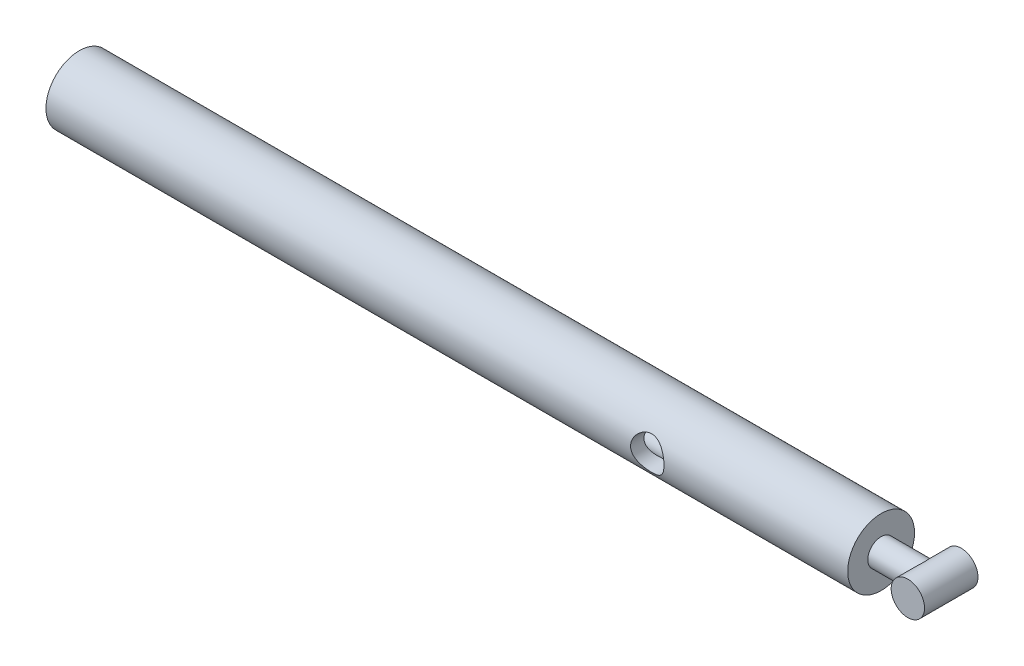
ISO-10303-21;
HEADER;
FILE_DESCRIPTION(('STEP AP214'),'2;1');
FILE_NAME('part.step','',(''),(''),'','','');
FILE_SCHEMA(('AUTOMOTIVE_DESIGN { 1 0 10303 214 1 1 1 1 }'));
ENDSEC;
DATA;
#1=APPLICATION_CONTEXT('core data for automotive mechanical design processes');
#2=APPLICATION_PROTOCOL_DEFINITION('international standard','automotive_design',2000,#1);
#3=PRODUCT_CONTEXT('',#1,'mechanical');
#4=PRODUCT('Part','Part','',(#3));
#5=PRODUCT_RELATED_PRODUCT_CATEGORY('part','',(#4));
#6=PRODUCT_DEFINITION_FORMATION('','',#4);
#7=PRODUCT_DEFINITION_CONTEXT('part definition',#1,'design');
#8=PRODUCT_DEFINITION('design','',#6,#7);
#9=PRODUCT_DEFINITION_SHAPE('','',#8);
#10=(LENGTH_UNIT() NAMED_UNIT(*) SI_UNIT(.MILLI.,.METRE.));
#11=(NAMED_UNIT(*) PLANE_ANGLE_UNIT() SI_UNIT($,.RADIAN.));
#12=(NAMED_UNIT(*) SI_UNIT($,.STERADIAN.) SOLID_ANGLE_UNIT());
#13=UNCERTAINTY_MEASURE_WITH_UNIT(LENGTH_MEASURE(1.E-05),#10,'distance_accuracy_value','');
#14=(GEOMETRIC_REPRESENTATION_CONTEXT(3) GLOBAL_UNCERTAINTY_ASSIGNED_CONTEXT((#13)) GLOBAL_UNIT_ASSIGNED_CONTEXT((#10,
#11,#12)) REPRESENTATION_CONTEXT('',''));
#15=CARTESIAN_POINT('',(0.,0.,0.));
#16=DIRECTION('',(0.,0.,1.));
#17=DIRECTION('',(1.,0.,0.));
#18=AXIS2_PLACEMENT_3D('',#15,#16,#17);
#19=CARTESIAN_POINT('',(0.,0.,0.));
#20=DIRECTION('',(1.,0.,0.));
#21=DIRECTION('',(0.,0.,-1.));
#22=AXIS2_PLACEMENT_3D('',#19,#20,#21);
#23=PLANE('',#22);
#24=CARTESIAN_POINT('',(0.,0.,0.));
#25=DIRECTION('',(1.,0.,0.));
#26=DIRECTION('',(0.,0.,-1.));
#27=AXIS2_PLACEMENT_3D('',#24,#25,#26);
#28=CIRCLE('',#27,5.);
#29=CARTESIAN_POINT('',(0.,0.,-5.));
#30=VERTEX_POINT('',#29);
#31=EDGE_CURVE('E45',#30,#30,#28,.T.);
#32=ORIENTED_EDGE('',*,*,#31,.T.);
#33=EDGE_LOOP('',(#32));
#34=FACE_BOUND('',#33,.T.);
#35=CARTESIAN_POINT('',(0.,0.,0.));
#36=DIRECTION('',(1.,0.,0.));
#37=DIRECTION('',(0.,0.,-1.));
#38=AXIS2_PLACEMENT_3D('',#35,#36,#37);
#39=CIRCLE('',#38,2.);
#40=CARTESIAN_POINT('',(0.,0.,-2.));
#41=VERTEX_POINT('',#40);
#42=EDGE_CURVE('E61',#41,#41,#39,.T.);
#43=ORIENTED_EDGE('',*,*,#42,.F.);
#44=EDGE_LOOP('',(#43));
#45=FACE_BOUND('',#44,.T.);
#46=ADVANCED_FACE('F32',(#34,#45),#23,.T.);
#47=CARTESIAN_POINT('',(-120.,0.,0.));
#48=DIRECTION('',(1.,0.,0.));
#49=DIRECTION('',(0.,0.,-1.));
#50=AXIS2_PLACEMENT_3D('',#47,#48,#49);
#51=CYLINDRICAL_SURFACE('',#50,5.);
#52=CARTESIAN_POINT('',(-27.5,0.,-5.));
#53=CARTESIAN_POINT('',(-27.500009669056,-0.131426682334305,-4.99999177550472));
#54=CARTESIAN_POINT('',(-27.510425561774,-0.263015634437213,-4.99476199135277));
#55=CARTESIAN_POINT('',(-27.5516318211621,-0.522301454622883,-4.9743541856102));
#56=CARTESIAN_POINT('',(-27.582460880925,-0.649990448564105,-4.9591572718767));
#57=CARTESIAN_POINT('',(-27.6629846227188,-0.897333631316203,-4.92040690922477));
#58=CARTESIAN_POINT('',(-27.7126059877827,-1.01701694536277,-4.89688595907259));
#59=CARTESIAN_POINT('',(-27.8289265262518,-1.24618160399671,-4.84364443325827));
#60=CARTESIAN_POINT('',(-27.8956243531451,-1.3556637520377,-4.81392434644421));
#61=CARTESIAN_POINT('',(-28.0487931316426,-1.56876952630998,-4.74890645050632));
#62=CARTESIAN_POINT('',(-28.1362162002298,-1.67163802294308,-4.71337997659091));
#63=CARTESIAN_POINT('',(-28.3263036959853,-1.86194861703332,-4.64149925776731));
#64=CARTESIAN_POINT('',(-28.4289796288401,-1.94937895911555,-4.60514440566897));
#65=CARTESIAN_POINT('',(-28.6562083744453,-2.11312999967247,-4.53247377945621));
#66=CARTESIAN_POINT('',(-28.781840246035,-2.18806333849064,-4.49637967412567));
#67=CARTESIAN_POINT('',(-29.0459183397954,-2.31542056761491,-4.43214946943555));
#68=CARTESIAN_POINT('',(-29.1843553217626,-2.36786053751682,-4.40400769020792));
#69=CARTESIAN_POINT('',(-29.4616627635964,-2.44533110537653,-4.36144667591402));
#70=CARTESIAN_POINT('',(-29.6000111301796,-2.47181464267578,-4.34630678958452));
#71=CARTESIAN_POINT('',(-29.8799470944376,-2.50106748329741,-4.3295472487215));
#72=CARTESIAN_POINT('',(-30.0215313521751,-2.50386022093906,-4.3279142335843));
#73=CARTESIAN_POINT('',(-30.2857150607909,-2.48671821792512,-4.33777325642937));
#74=CARTESIAN_POINT('',(-30.4085600780583,-2.46946139884055,-4.34771909154984));
#75=CARTESIAN_POINT('',(-30.6493047734319,-2.41734962264384,-4.37690571834675));
#76=CARTESIAN_POINT('',(-30.7672028632631,-2.38248905974454,-4.39614947079454));
#77=CARTESIAN_POINT('',(-30.9980728314143,-2.29552445096459,-4.44218691031839));
#78=CARTESIAN_POINT('',(-31.1108659969645,-2.24303766778987,-4.46914601659993));
#79=CARTESIAN_POINT('',(-31.326585731475,-2.12260421917012,-4.52758510703513));
#80=CARTESIAN_POINT('',(-31.4295078390002,-2.0546506095312,-4.55906711950478));
#81=CARTESIAN_POINT('',(-31.6363031318581,-1.89516513728193,-4.62782894758213));
#82=CARTESIAN_POINT('',(-31.7386421839404,-1.80173614592319,-4.66533775591865));
#83=CARTESIAN_POINT('',(-31.9268385464773,-1.59888894685344,-4.73869058251019));
#84=CARTESIAN_POINT('',(-32.0126879800847,-1.48946314143571,-4.77453379897003));
#85=CARTESIAN_POINT('',(-32.1692141525743,-1.25129126457962,-4.84254968207409));
#86=CARTESIAN_POINT('',(-32.2390011811144,-1.12188397899853,-4.87447460405015));
#87=CARTESIAN_POINT('',(-32.3552425726075,-0.851165538721983,-4.92894702803108));
#88=CARTESIAN_POINT('',(-32.4017154625379,-0.70986394066316,-4.95150197358893));
#89=CARTESIAN_POINT('',(-32.4661885092917,-0.43191622915178,-4.98310834353579));
#90=CARTESIAN_POINT('',(-32.486228089367,-0.295853826370906,-4.9931234575324));
#91=CARTESIAN_POINT('',(-32.5036618278362,-0.0219489998732893,-5.00182533647794));
#92=CARTESIAN_POINT('',(-32.5010667140985,0.115892549675108,-5.00051746803426));
#93=CARTESIAN_POINT('',(-32.4744832789533,0.378082429964655,-4.98727980633468));
#94=CARTESIAN_POINT('',(-32.4521686681756,0.502648520123705,-4.97618114219992));
#95=CARTESIAN_POINT('',(-32.3894048202616,0.746017230755971,-4.94555428287529));
#96=CARTESIAN_POINT('',(-32.3489535838641,0.864819214231883,-4.92602515837625));
#97=CARTESIAN_POINT('',(-32.2500038339196,1.09722152111965,-4.87960628532329));
#98=CARTESIAN_POINT('',(-32.1910223747177,1.21057599249831,-4.85252204417873));
#99=CARTESIAN_POINT('',(-32.0572311608752,1.42615340426439,-4.7935993579975));
#100=CARTESIAN_POINT('',(-31.9824146634801,1.52837157450203,-4.76175888940534));
#101=CARTESIAN_POINT('',(-31.8105989367091,1.72941922315487,-4.69270553315087));
#102=CARTESIAN_POINT('',(-31.7121428290248,1.82693019428496,-4.65527212009488));
#103=CARTESIAN_POINT('',(-31.5001871219506,2.0046408025722,-4.58155978921587));
#104=CARTESIAN_POINT('',(-31.3866772029301,2.08482846428685,-4.54528168472407));
#105=CARTESIAN_POINT('',(-31.1408908645153,2.22926978618994,-4.4762798054528));
#106=CARTESIAN_POINT('',(-31.0079718347089,2.29256373922243,-4.44381323981254));
#107=CARTESIAN_POINT('',(-30.7312248311174,2.39520706511459,-4.38935180726746));
#108=CARTESIAN_POINT('',(-30.587411184,2.43458729077055,-4.36734345549014));
#109=CARTESIAN_POINT('',(-30.3077244426371,2.48465421767005,-4.33903752569351));
#110=CARTESIAN_POINT('',(-30.172414365881,2.4977324874436,-4.33143458674096));
#111=CARTESIAN_POINT('',(-29.9013823326193,2.50172288950898,-4.32913386592579));
#112=CARTESIAN_POINT('',(-29.7656605801264,2.49264462983266,-4.3344304902511));
#113=CARTESIAN_POINT('',(-29.5112912443832,2.45481530197332,-4.35594655164663));
#114=CARTESIAN_POINT('',(-29.3922488182792,2.42802074302696,-4.37107736338133));
#115=CARTESIAN_POINT('',(-29.1604797078,2.35793843840543,-4.40927540337602));
#116=CARTESIAN_POINT('',(-29.0477550684335,2.31464538728732,-4.43234518434965));
#117=CARTESIAN_POINT('',(-28.8234378472803,2.20953919315538,-4.48571326433412));
#118=CARTESIAN_POINT('',(-28.712430148265,2.14667719009403,-4.5163930799845));
#119=CARTESIAN_POINT('',(-28.50181375676,2.0053780838799,-4.58088327077455));
#120=CARTESIAN_POINT('',(-28.4022110373713,1.92693287765888,-4.61469526970767));
#121=CARTESIAN_POINT('',(-28.2046446362504,1.74550556946065,-4.68655816327011));
#122=CARTESIAN_POINT('',(-28.1083506358286,1.6407002246921,-4.7246249151498));
#123=CARTESIAN_POINT('',(-27.934344150572,1.41539785420684,-4.79694347383545));
#124=CARTESIAN_POINT('',(-27.8566416813941,1.29489242426332,-4.83119321905446));
#125=CARTESIAN_POINT('',(-27.7219030205159,1.03978808878536,-4.89245149457782));
#126=CARTESIAN_POINT('',(-27.6650168322155,0.905095560782286,-4.91940711437488));
#127=CARTESIAN_POINT('',(-27.5978161412076,0.69632870925735,-4.9517796092335));
#128=CARTESIAN_POINT('',(-27.5784446019982,0.625670413494087,-4.96122314081874));
#129=CARTESIAN_POINT('',(-27.5459340516294,0.482623997839257,-4.97717127275101));
#130=CARTESIAN_POINT('',(-27.5327912333236,0.4102369630924,-4.98367766823159));
#131=CARTESIAN_POINT('',(-27.5152625277154,0.28151868462167,-4.9923820076613));
#132=CARTESIAN_POINT('',(-27.5095450634687,0.225408499555443,-4.99523288466454));
#133=CARTESIAN_POINT('',(-27.5019116705343,0.112875528456288,-4.99904367329658));
#134=CARTESIAN_POINT('',(-27.4999958467745,0.0564527338382177,-5.00000353273198));
#135=CARTESIAN_POINT('',(-27.5,0.,-5.));
#136=B_SPLINE_CURVE_WITH_KNOTS('',3,(#52,#53,#54,#55,#56,#57,#58,#59,#60,#61,#62,#63,#64,#65,
#66,#67,#68,#69,#70,#71,#72,#73,#74,#75,#76,#77,#78,#79,#80,#81,#82,#83,#84,#85,#86,#87,#88,#89,
#90,#91,#92,#93,#94,#95,#96,#97,#98,#99,#100,#101,#102,#103,#104,#105,#106,#107,#108,#109,#110,
#111,#112,#113,#114,#115,#116,#117,#118,#119,#120,#121,#122,#123,#124,#125,#126,#127,#128,#129,
#130,#131,#132,#133,#134,#135),.UNSPECIFIED.,.T.,.F.,(4,2,2,2,2,2,2,2,2,2,2,2,2,2,2,2,2,2,2,2,2,
2,2,2,2,2,2,2,2,2,2,2,2,2,2,2,2,2,2,2,2,4),(0.,0.394060643550732,0.788870374272994,
1.18215538873075,1.57540940145392,1.99245439679522,2.40981559413509,2.85954316076881,
3.30894869745702,3.73145030350573,4.15353393322551,4.52514281023301,4.89687009814196,
5.27725600421218,5.65781303150555,6.08662353334696,6.51563836496716,6.96457555536101,
7.41315542280699,7.82458226178364,8.2358141127869,8.61517266265304,8.99457304077329,
9.38482140069746,9.77523626870848,10.2039902661037,10.6330397153795,11.0828670540368,
11.53211279863,11.9382326875698,12.3441764966106,12.7114482562151,13.0788382197025,
13.4709114195009,13.8631890285845,14.303131068923,14.7433095845248,15.1866003415819,
15.407934939208,15.6291340766843,15.7983933645035,15.9676573239322),.UNSPECIFIED.);
#137=CARTESIAN_POINT('',(-27.5,0.,-5.));
#138=VERTEX_POINT('',#137);
#139=EDGE_CURVE('E95',#138,#138,#136,.T.);
#140=ORIENTED_EDGE('',*,*,#139,.F.);
#141=EDGE_LOOP('',(#140));
#142=FACE_BOUND('',#141,.T.);
#143=CARTESIAN_POINT('',(-27.5,0.,5.));
#144=CARTESIAN_POINT('',(-27.500009669056,0.131426682334305,4.99999177550472));
#145=CARTESIAN_POINT('',(-27.510425561774,0.263015634437213,4.99476199135277));
#146=CARTESIAN_POINT('',(-27.5516318211621,0.522301454622883,4.9743541856102));
#147=CARTESIAN_POINT('',(-27.582460880925,0.649990448564105,4.9591572718767));
#148=CARTESIAN_POINT('',(-27.6629846227188,0.897333631316203,4.92040690922477));
#149=CARTESIAN_POINT('',(-27.7126059877827,1.01701694536277,4.89688595907259));
#150=CARTESIAN_POINT('',(-27.8289265262518,1.24618160399671,4.84364443325827));
#151=CARTESIAN_POINT('',(-27.8956243531451,1.3556637520377,4.81392434644421));
#152=CARTESIAN_POINT('',(-28.0487931316426,1.56876952630998,4.74890645050632));
#153=CARTESIAN_POINT('',(-28.1362162002298,1.67163802294308,4.71337997659091));
#154=CARTESIAN_POINT('',(-28.3263036959853,1.86194861703332,4.64149925776731));
#155=CARTESIAN_POINT('',(-28.4289796288401,1.94937895911555,4.60514440566897));
#156=CARTESIAN_POINT('',(-28.6562083744453,2.11312999967247,4.53247377945621));
#157=CARTESIAN_POINT('',(-28.781840246035,2.18806333849064,4.49637967412567));
#158=CARTESIAN_POINT('',(-29.0459183397954,2.31542056761491,4.43214946943555));
#159=CARTESIAN_POINT('',(-29.1843553217626,2.36786053751682,4.40400769020792));
#160=CARTESIAN_POINT('',(-29.4616627635964,2.44533110537653,4.36144667591402));
#161=CARTESIAN_POINT('',(-29.6000111301796,2.47181464267578,4.34630678958452));
#162=CARTESIAN_POINT('',(-29.8799470944376,2.50106748329741,4.3295472487215));
#163=CARTESIAN_POINT('',(-30.0215313521751,2.50386022093906,4.3279142335843));
#164=CARTESIAN_POINT('',(-30.2857150607909,2.48671821792512,4.33777325642937));
#165=CARTESIAN_POINT('',(-30.4085600780583,2.46946139884055,4.34771909154984));
#166=CARTESIAN_POINT('',(-30.6493047734319,2.41734962264384,4.37690571834675));
#167=CARTESIAN_POINT('',(-30.7672028632631,2.38248905974454,4.39614947079454));
#168=CARTESIAN_POINT('',(-30.9980728314143,2.29552445096459,4.44218691031839));
#169=CARTESIAN_POINT('',(-31.1108659969645,2.24303766778987,4.46914601659993));
#170=CARTESIAN_POINT('',(-31.326585731475,2.12260421917012,4.52758510703513));
#171=CARTESIAN_POINT('',(-31.4295078390002,2.0546506095312,4.55906711950478));
#172=CARTESIAN_POINT('',(-31.6363031318581,1.89516513728193,4.62782894758213));
#173=CARTESIAN_POINT('',(-31.7386421839404,1.80173614592319,4.66533775591865));
#174=CARTESIAN_POINT('',(-31.9268385464773,1.59888894685344,4.73869058251019));
#175=CARTESIAN_POINT('',(-32.0126879800847,1.48946314143571,4.77453379897003));
#176=CARTESIAN_POINT('',(-32.1692141525743,1.25129126457962,4.84254968207409));
#177=CARTESIAN_POINT('',(-32.2390011811144,1.12188397899853,4.87447460405015));
#178=CARTESIAN_POINT('',(-32.3552425726075,0.851165538721983,4.92894702803108));
#179=CARTESIAN_POINT('',(-32.4017154625379,0.70986394066316,4.95150197358893));
#180=CARTESIAN_POINT('',(-32.4661885092917,0.43191622915178,4.98310834353579));
#181=CARTESIAN_POINT('',(-32.486228089367,0.295853826370906,4.9931234575324));
#182=CARTESIAN_POINT('',(-32.5036618278362,0.0219489998732893,5.00182533647794));
#183=CARTESIAN_POINT('',(-32.5010667140985,-0.115892549675108,5.00051746803426));
#184=CARTESIAN_POINT('',(-32.4744832789533,-0.378082429964655,4.98727980633468));
#185=CARTESIAN_POINT('',(-32.4521686681756,-0.502648520123705,4.97618114219992));
#186=CARTESIAN_POINT('',(-32.3894048202616,-0.746017230755971,4.94555428287529));
#187=CARTESIAN_POINT('',(-32.3489535838641,-0.864819214231883,4.92602515837625));
#188=CARTESIAN_POINT('',(-32.2500038339196,-1.09722152111965,4.87960628532329));
#189=CARTESIAN_POINT('',(-32.1910223747177,-1.21057599249831,4.85252204417873));
#190=CARTESIAN_POINT('',(-32.0572311608752,-1.42615340426439,4.7935993579975));
#191=CARTESIAN_POINT('',(-31.9824146634801,-1.52837157450203,4.76175888940534));
#192=CARTESIAN_POINT('',(-31.8105989367091,-1.72941922315487,4.69270553315087));
#193=CARTESIAN_POINT('',(-31.7121428290248,-1.82693019428496,4.65527212009488));
#194=CARTESIAN_POINT('',(-31.5001871219506,-2.0046408025722,4.58155978921587));
#195=CARTESIAN_POINT('',(-31.3866772029301,-2.08482846428685,4.54528168472407));
#196=CARTESIAN_POINT('',(-31.1408908645153,-2.22926978618994,4.4762798054528));
#197=CARTESIAN_POINT('',(-31.0079718347089,-2.29256373922243,4.44381323981254));
#198=CARTESIAN_POINT('',(-30.7312248311174,-2.39520706511459,4.38935180726746));
#199=CARTESIAN_POINT('',(-30.587411184,-2.43458729077055,4.36734345549014));
#200=CARTESIAN_POINT('',(-30.3077244426371,-2.48465421767005,4.33903752569351));
#201=CARTESIAN_POINT('',(-30.172414365881,-2.4977324874436,4.33143458674096));
#202=CARTESIAN_POINT('',(-29.9013823326193,-2.50172288950898,4.32913386592579));
#203=CARTESIAN_POINT('',(-29.7656605801264,-2.49264462983266,4.3344304902511));
#204=CARTESIAN_POINT('',(-29.5112912443832,-2.45481530197332,4.35594655164663));
#205=CARTESIAN_POINT('',(-29.3922488182792,-2.42802074302696,4.37107736338133));
#206=CARTESIAN_POINT('',(-29.1604797078,-2.35793843840543,4.40927540337602));
#207=CARTESIAN_POINT('',(-29.0477550684335,-2.31464538728732,4.43234518434965));
#208=CARTESIAN_POINT('',(-28.8234378472803,-2.20953919315538,4.48571326433412));
#209=CARTESIAN_POINT('',(-28.712430148265,-2.14667719009403,4.5163930799845));
#210=CARTESIAN_POINT('',(-28.50181375676,-2.0053780838799,4.58088327077455));
#211=CARTESIAN_POINT('',(-28.4022110373713,-1.92693287765888,4.61469526970767));
#212=CARTESIAN_POINT('',(-28.2046446362504,-1.74550556946065,4.68655816327011));
#213=CARTESIAN_POINT('',(-28.1083506358286,-1.6407002246921,4.7246249151498));
#214=CARTESIAN_POINT('',(-27.934344150572,-1.41539785420684,4.79694347383545));
#215=CARTESIAN_POINT('',(-27.8566416813941,-1.29489242426332,4.83119321905446));
#216=CARTESIAN_POINT('',(-27.7219030205159,-1.03978808878536,4.89245149457782));
#217=CARTESIAN_POINT('',(-27.6650168322155,-0.905095560782286,4.91940711437488));
#218=CARTESIAN_POINT('',(-27.5978161412076,-0.69632870925735,4.9517796092335));
#219=CARTESIAN_POINT('',(-27.5784446019982,-0.625670413494087,4.96122314081874));
#220=CARTESIAN_POINT('',(-27.5459340516294,-0.482623997839257,4.97717127275101));
#221=CARTESIAN_POINT('',(-27.5327912333236,-0.4102369630924,4.98367766823159));
#222=CARTESIAN_POINT('',(-27.5152625277154,-0.28151868462167,4.9923820076613));
#223=CARTESIAN_POINT('',(-27.5095450634687,-0.225408499555443,4.99523288466454));
#224=CARTESIAN_POINT('',(-27.5019116705343,-0.112875528456288,4.99904367329658));
#225=CARTESIAN_POINT('',(-27.4999958467745,-0.0564527338382177,5.00000353273198));
#226=CARTESIAN_POINT('',(-27.5,0.,5.));
#227=B_SPLINE_CURVE_WITH_KNOTS('',3,(#143,#144,#145,#146,#147,#148,#149,#150,#151,#152,#153,
#154,#155,#156,#157,#158,#159,#160,#161,#162,#163,#164,#165,#166,#167,#168,#169,#170,#171,#172,
#173,#174,#175,#176,#177,#178,#179,#180,#181,#182,#183,#184,#185,#186,#187,#188,#189,#190,#191,
#192,#193,#194,#195,#196,#197,#198,#199,#200,#201,#202,#203,#204,#205,#206,#207,#208,#209,#210,
#211,#212,#213,#214,#215,#216,#217,#218,#219,#220,#221,#222,#223,#224,#225,#226),.UNSPECIFIED.,
.T.,.F.,(4,2,2,2,2,2,2,2,2,2,2,2,2,2,2,2,2,2,2,2,2,2,2,2,2,2,2,2,2,2,2,2,2,2,2,2,2,2,2,2,2,4),
(0.,0.394060643550732,0.788870374272994,1.18215538873075,1.57540940145392,1.99245439679522,
2.40981559413509,2.85954316076881,3.30894869745702,3.73145030350573,4.15353393322551,
4.52514281023301,4.89687009814196,5.27725600421218,5.65781303150555,6.08662353334696,
6.51563836496716,6.96457555536101,7.41315542280699,7.82458226178364,8.2358141127869,
8.61517266265304,8.99457304077329,9.38482140069746,9.77523626870848,10.2039902661037,
10.6330397153795,11.0828670540368,11.53211279863,11.9382326875698,12.3441764966106,
12.7114482562151,13.0788382197025,13.4709114195009,13.8631890285845,14.303131068923,
14.7433095845248,15.1866003415819,15.407934939208,15.6291340766843,15.7983933645035,
15.9676573239322),.UNSPECIFIED.);
#228=CARTESIAN_POINT('',(-27.5,0.,5.));
#229=VERTEX_POINT('',#228);
#230=EDGE_CURVE('E91',#229,#229,#227,.T.);
#231=ORIENTED_EDGE('',*,*,#230,.F.);
#232=EDGE_LOOP('',(#231));
#233=FACE_BOUND('',#232,.T.);
#234=CARTESIAN_POINT('',(-120.,0.,0.));
#235=DIRECTION('',(1.,0.,0.));
#236=DIRECTION('',(0.,0.,-1.));
#237=AXIS2_PLACEMENT_3D('',#234,#235,#236);
#238=CIRCLE('',#237,5.);
#239=CARTESIAN_POINT('',(-120.,0.,-5.));
#240=VERTEX_POINT('',#239);
#241=EDGE_CURVE('E10',#240,#240,#238,.T.);
#242=ORIENTED_EDGE('',*,*,#241,.T.);
#243=EDGE_LOOP('',(#242));
#244=FACE_BOUND('',#243,.T.);
#245=ORIENTED_EDGE('',*,*,#31,.F.);
#246=EDGE_LOOP('',(#245));
#247=FACE_BOUND('',#246,.T.);
#248=ADVANCED_FACE('F34',(#142,#233,#244,#247),#51,.T.);
#249=CARTESIAN_POINT('',(-120.,0.,0.));
#250=DIRECTION('',(1.,0.,0.));
#251=DIRECTION('',(0.,0.,-1.));
#252=AXIS2_PLACEMENT_3D('',#249,#250,#251);
#253=PLANE('',#252);
#254=CARTESIAN_POINT('',(-120.,0.,0.));
#255=DIRECTION('',(-1.,0.,0.));
#256=DIRECTION('',(0.,0.,1.));
#257=AXIS2_PLACEMENT_3D('',#254,#255,#256);
#258=CIRCLE('',#257,2.5);
#259=CARTESIAN_POINT('',(-120.,0.,2.5));
#260=VERTEX_POINT('',#259);
#261=EDGE_CURVE('E50',#260,#260,#258,.T.);
#262=ORIENTED_EDGE('',*,*,#261,.F.);
#263=EDGE_LOOP('',(#262));
#264=FACE_BOUND('',#263,.T.);
#265=ORIENTED_EDGE('',*,*,#241,.F.);
#266=EDGE_LOOP('',(#265));
#267=FACE_BOUND('',#266,.T.);
#268=ADVANCED_FACE('F121',(#264,#267),#253,.F.);
#269=CARTESIAN_POINT('',(-100.,0.,0.));
#270=DIRECTION('',(-1.,0.,0.));
#271=DIRECTION('',(0.,0.,1.));
#272=AXIS2_PLACEMENT_3D('',#269,#270,#271);
#273=CYLINDRICAL_SURFACE('',#272,2.5);
#274=CARTESIAN_POINT('',(-100.,0.,0.));
#275=DIRECTION('',(-1.,0.,0.));
#276=DIRECTION('',(0.,0.,1.));
#277=AXIS2_PLACEMENT_3D('',#274,#275,#276);
#278=CIRCLE('',#277,2.5);
#279=CARTESIAN_POINT('',(-100.,0.,2.5));
#280=VERTEX_POINT('',#279);
#281=EDGE_CURVE('E111',#280,#280,#278,.F.);
#282=ORIENTED_EDGE('',*,*,#281,.T.);
#283=EDGE_LOOP('',(#282));
#284=FACE_BOUND('',#283,.T.);
#285=ORIENTED_EDGE('',*,*,#261,.T.);
#286=EDGE_LOOP('',(#285));
#287=FACE_BOUND('',#286,.T.);
#288=ADVANCED_FACE('F119',(#284,#287),#273,.F.);
#289=CARTESIAN_POINT('',(-100.,0.,0.));
#290=DIRECTION('',(-1.,0.,0.));
#291=DIRECTION('',(0.,0.,1.));
#292=AXIS2_PLACEMENT_3D('',#289,#290,#291);
#293=PLANE('',#292);
#294=CARTESIAN_POINT('',(-100.,0.,0.));
#295=DIRECTION('',(-1.,0.,0.));
#296=DIRECTION('',(0.,0.,1.));
#297=AXIS2_PLACEMENT_3D('',#294,#295,#296);
#298=CIRCLE('',#297,3.);
#299=CARTESIAN_POINT('',(-100.,0.,3.));
#300=VERTEX_POINT('',#299);
#301=EDGE_CURVE('E107',#300,#300,#298,.T.);
#302=ORIENTED_EDGE('',*,*,#301,.F.);
#303=EDGE_LOOP('',(#302));
#304=FACE_BOUND('',#303,.T.);
#305=ORIENTED_EDGE('',*,*,#281,.F.);
#306=EDGE_LOOP('',(#305));
#307=FACE_BOUND('',#306,.T.);
#308=ADVANCED_FACE('F129',(#304,#307),#293,.F.);
#309=CARTESIAN_POINT('',(-20.,0.,0.));
#310=DIRECTION('',(-1.,0.,0.));
#311=DIRECTION('',(0.,0.,1.));
#312=AXIS2_PLACEMENT_3D('',#309,#310,#311);
#313=CYLINDRICAL_SURFACE('',#312,3.);
#314=CARTESIAN_POINT('',(-27.5,0.,3.));
#315=CARTESIAN_POINT('',(-27.5000048855537,0.118757533193203,2.99999522795205));
#316=CARTESIAN_POINT('',(-27.5085225039046,0.237551281104128,2.99288670594742));
#317=CARTESIAN_POINT('',(-27.5419627233518,0.471182492492811,2.96510762868268));
#318=CARTESIAN_POINT('',(-27.5668974739753,0.586016959612417,2.94442702942007));
#319=CARTESIAN_POINT('',(-27.6313121173327,0.807829942407297,2.89142690238865));
#320=CARTESIAN_POINT('',(-27.6707050743537,0.9148509209049,2.8591769655007));
#321=CARTESIAN_POINT('',(-27.7620170479426,1.11984139043408,2.78529176182903));
#322=CARTESIAN_POINT('',(-27.8139402966733,1.21780780775233,2.74365332434937));
#323=CARTESIAN_POINT('',(-27.9494537498082,1.43789998519767,2.63674191529867));
#324=CARTESIAN_POINT('',(-28.0376702041822,1.5556821965722,2.56840549256191));
#325=CARTESIAN_POINT('',(-28.2305243257514,1.77202398328147,2.42422624777674));
#326=CARTESIAN_POINT('',(-28.3352075692431,1.87052845158605,2.34836281453276));
#327=CARTESIAN_POINT('',(-28.5040842764911,2.00437263805589,2.23294886313738));
#328=CARTESIAN_POINT('',(-28.5629555761913,2.04699726278816,2.19383679994997));
#329=CARTESIAN_POINT('',(-28.6845056029605,2.12715295529554,2.11620611809193));
#330=CARTESIAN_POINT('',(-28.7471855948707,2.16468231743739,2.07768770195023));
#331=CARTESIAN_POINT('',(-28.8762673243356,2.23441122570746,2.00250543288661));
#332=CARTESIAN_POINT('',(-28.9426597847248,2.26662332666227,1.96583735754651));
#333=CARTESIAN_POINT('',(-29.0794462839284,2.32553690612792,1.89577686630311));
#334=CARTESIAN_POINT('',(-29.1498368473418,2.3522430799868,1.86238167220904));
#335=CARTESIAN_POINT('',(-29.3016670902001,2.40193513934005,1.79791918980412));
#336=CARTESIAN_POINT('',(-29.3835240927235,2.42433807692598,1.76736311251003));
#337=CARTESIAN_POINT('',(-29.5518897688131,2.46101313675502,1.71593180556004));
#338=CARTESIAN_POINT('',(-29.6383865866147,2.47530499393792,1.69503310194197));
#339=CARTESIAN_POINT('',(-29.8157654083795,2.49481072799048,1.66620928968844));
#340=CARTESIAN_POINT('',(-29.9066879590707,2.49991205058667,1.65844510563093));
#341=CARTESIAN_POINT('',(-30.0885626130028,2.5000856937119,1.65818308531825));
#342=CARTESIAN_POINT('',(-30.1795147166153,2.49515788278404,1.6656854491694));
#343=CARTESIAN_POINT('',(-30.3655247108271,2.47505262029594,1.69541639464498));
#344=CARTESIAN_POINT('',(-30.4602937457171,2.45905577113332,1.71881932066467));
#345=CARTESIAN_POINT('',(-30.6442109812022,2.41742550503027,1.77688235738914));
#346=CARTESIAN_POINT('',(-30.7333393707148,2.39176011044289,1.81157977103025));
#347=CARTESIAN_POINT('',(-30.8878270785411,2.33816270346873,1.88002226126137));
#348=CARTESIAN_POINT('',(-30.9543122424116,2.31177513033566,1.91250316845439));
#349=CARTESIAN_POINT('',(-31.0836508067799,2.25404424958636,1.9802199666153));
#350=CARTESIAN_POINT('',(-31.1465020478658,2.22269803586305,2.01545746697786));
#351=CARTESIAN_POINT('',(-31.3299668410197,2.12149677560465,2.12342648109725));
#352=CARTESIAN_POINT('',(-31.4454141476061,2.04450664231776,2.19837696967439));
#353=CARTESIAN_POINT('',(-31.6682669624544,1.86765914501414,2.35079897952278));
#354=CARTESIAN_POINT('',(-31.7749383239919,1.76681805277628,2.42819792618945));
#355=CARTESIAN_POINT('',(-31.9711123448174,1.54484388336148,2.57509054043286));
#356=CARTESIAN_POINT('',(-32.0606520330563,1.42375565615772,2.64460112267365));
#357=CARTESIAN_POINT('',(-32.1994148390986,1.19411179169415,2.75428914126548));
#358=CARTESIAN_POINT('',(-32.2531428981877,1.08972732107276,2.79748350073996));
#359=CARTESIAN_POINT('',(-32.3463427452553,0.871071458330355,2.87307804019802));
#360=CARTESIAN_POINT('',(-32.3858234315806,0.75680629278075,2.90548495660805));
#361=CARTESIAN_POINT('',(-32.4484172499322,0.519954301215405,2.95709834265565));
#362=CARTESIAN_POINT('',(-32.4714039466576,0.397310923125296,2.97620280955845));
#363=CARTESIAN_POINT('',(-32.4987092319272,0.148559976923715,2.99891434528972));
#364=CARTESIAN_POINT('',(-32.5030403108502,0.0224547835239897,3.00253178304177));
#365=CARTESIAN_POINT('',(-32.4933375605562,-0.213310199456588,2.99444999039147));
#366=CARTESIAN_POINT('',(-32.4814413612848,-0.323130540835872,2.98453350716313));
#367=CARTESIAN_POINT('',(-32.4437330497885,-0.538644964400617,2.95325589460135));
#368=CARTESIAN_POINT('',(-32.417919268281,-0.644338549989573,2.93189339242796));
#369=CARTESIAN_POINT('',(-32.3533766045447,-0.850565499199267,2.87889521546186));
#370=CARTESIAN_POINT('',(-32.3144792105557,-0.951010682223327,2.84712564891974));
#371=CARTESIAN_POINT('',(-32.2256043676633,-1.14365900898105,2.77536124733889));
#372=CARTESIAN_POINT('',(-32.1756228230067,-1.23585908831211,2.73536337221808));
#373=CARTESIAN_POINT('',(-32.041568204653,-1.450674397351,2.62975152158594));
#374=CARTESIAN_POINT('',(-31.9522674167327,-1.56834359540732,2.56070244234714));
#375=CARTESIAN_POINT('',(-31.7571596173444,-1.78428994740848,2.4152244540319));
#376=CARTESIAN_POINT('',(-31.6513015446452,-1.88250490855173,2.33877300422834));
#377=CARTESIAN_POINT('',(-31.4805880320714,-2.01573314784291,2.222698055986));
#378=CARTESIAN_POINT('',(-31.421101727024,-2.0581106914395,2.18341151736029));
#379=CARTESIAN_POINT('',(-31.2982791839677,-2.13771669597407,2.1055315381718));
#380=CARTESIAN_POINT('',(-31.2349415723359,-2.17494330406756,2.06693835133606));
#381=CARTESIAN_POINT('',(-31.1045115960848,-2.24398857026758,1.99176108482639));
#382=CARTESIAN_POINT('',(-31.0374297754664,-2.27582148781538,1.95517188634211));
#383=CARTESIAN_POINT('',(-30.8992098955002,-2.3338885673946,1.88547561448178));
#384=CARTESIAN_POINT('',(-30.8280756295806,-2.36012785984656,1.8523653645079));
#385=CARTESIAN_POINT('',(-30.6757296316481,-2.40837357148322,1.78925557416047));
#386=CARTESIAN_POINT('',(-30.5941655489263,-2.42988314318545,1.75970711786653));
#387=CARTESIAN_POINT('',(-30.4265480460574,-2.46482255689514,1.71043063887427));
#388=CARTESIAN_POINT('',(-30.3405064286721,-2.47827257713357,1.69067811225259));
#389=CARTESIAN_POINT('',(-30.1643623925877,-2.49617289535263,1.6641531597946));
#390=CARTESIAN_POINT('',(-30.0742246702493,-2.5005179918396,1.65753251048392));
#391=CARTESIAN_POINT('',(-29.8941467872161,-2.49938197104455,1.65924308630667));
#392=CARTESIAN_POINT('',(-29.8042066848749,-2.49389826274012,1.66757825402155));
#393=CARTESIAN_POINT('',(-29.6183274246095,-2.4726526384854,1.6989289873552));
#394=CARTESIAN_POINT('',(-29.5227697294673,-2.45585812550761,1.72341371023858));
#395=CARTESIAN_POINT('',(-29.3374687039173,-2.41250339675091,1.78358728037388));
#396=CARTESIAN_POINT('',(-29.2477457712907,-2.38591088285908,1.81931312531327));
#397=CARTESIAN_POINT('',(-29.0922109586452,-2.33050835844918,1.88952619366194));
#398=CARTESIAN_POINT('',(-29.0252562407651,-2.30325853049531,1.92277816627792));
#399=CARTESIAN_POINT('',(-28.8950536135756,-2.24370627018012,1.99195185230571));
#400=CARTESIAN_POINT('',(-28.8318078890002,-2.21140090020863,2.0278751115052));
#401=CARTESIAN_POINT('',(-28.647270438658,-2.10716294428985,2.13775931167913));
#402=CARTESIAN_POINT('',(-28.5312530750081,-2.02793576743751,2.21379780164321));
#403=CARTESIAN_POINT('',(-28.3079927387087,-1.84629697567413,2.36772603763547));
#404=CARTESIAN_POINT('',(-28.2014582059671,-1.7429395959328,2.44552394429513));
#405=CARTESIAN_POINT('',(-28.0061362004607,-1.5155355493562,2.59256498427755));
#406=CARTESIAN_POINT('',(-27.917309434126,-1.39153583663214,2.66182692543068));
#407=CARTESIAN_POINT('',(-27.7816858032769,-1.15855518141082,2.76942305781509));
#408=CARTESIAN_POINT('',(-27.7299614897806,-1.05399877947692,2.81112174006883));
#409=CARTESIAN_POINT('',(-27.6407813297614,-0.835439786054347,2.88361460666453));
#410=CARTESIAN_POINT('',(-27.6033064759047,-0.721450026753894,2.9144233132377));
#411=CARTESIAN_POINT('',(-27.5498115441734,-0.506620038886849,2.95858745904691));
#412=CARTESIAN_POINT('',(-27.5312248777732,-0.406845468761916,2.97402142398111));
#413=CARTESIAN_POINT('',(-27.5063176317619,-0.204722725654232,2.99472922794408));
#414=CARTESIAN_POINT('',(-27.4999957884131,-0.102374818922781,3.00000411373941));
#415=CARTESIAN_POINT('',(-27.5,0.,3.));
#416=B_SPLINE_CURVE_WITH_KNOTS('',3,(#314,#315,#316,#317,#318,#319,#320,#321,#322,#323,#324,
#325,#326,#327,#328,#329,#330,#331,#332,#333,#334,#335,#336,#337,#338,#339,#340,#341,#342,#343,
#344,#345,#346,#347,#348,#349,#350,#351,#352,#353,#354,#355,#356,#357,#358,#359,#360,#361,#362,
#363,#364,#365,#366,#367,#368,#369,#370,#371,#372,#373,#374,#375,#376,#377,#378,#379,#380,#381,
#382,#383,#384,#385,#386,#387,#388,#389,#390,#391,#392,#393,#394,#395,#396,#397,#398,#399,#400,
#401,#402,#403,#404,#405,#406,#407,#408,#409,#410,#411,#412,#413,#414,#415),.UNSPECIFIED.,.T.,
.F.,(4,2,2,2,2,2,2,2,2,2,2,2,2,2,2,2,2,2,2,2,2,2,2,2,2,2,2,2,2,2,2,2,2,2,2,2,2,2,2,2,2,2,2,2,2,
2,2,2,2,2,4),(0.,0.355841276815114,0.711946191026961,1.0659440535955,1.42006164830116,
1.90425178760126,2.38980643116775,2.63722280423449,2.88472179650725,3.13162777943676,
3.37832232674674,3.64812890035754,3.91727616616869,4.18969776924975,4.46212294312047,
4.75723524199722,5.05333228584568,5.28870178855695,5.52420974868634,5.99549339358981,
6.49137310548272,6.98616858956868,7.36002155957576,7.73364063000477,8.11009395319722,
8.48629519274361,8.81743460677927,9.14861374669873,9.48423297747607,9.81997643164434,
10.3065635514456,10.7946819775667,11.0432812121088,11.2919696391639,11.5399899810636,
11.787781852862,12.0551105531685,12.3217671309317,12.5914881373799,12.8612802568452,
13.1598101383752,13.4593330283462,13.6977271411687,13.9362602949129,14.4135864576438,
14.914300110886,15.413889999571,15.7841228897598,16.1538601797496,16.4606444271243,
16.7673970625124),.UNSPECIFIED.);
#417=CARTESIAN_POINT('',(-27.5,0.,3.));
#418=VERTEX_POINT('',#417);
#419=EDGE_CURVE('E37',#418,#418,#416,.T.);
#420=ORIENTED_EDGE('',*,*,#419,.T.);
#421=EDGE_LOOP('',(#420));
#422=FACE_BOUND('',#421,.T.);
#423=CARTESIAN_POINT('',(-27.5,0.,-3.));
#424=CARTESIAN_POINT('',(-27.5000048855537,-0.118757533193203,-2.99999522795205));
#425=CARTESIAN_POINT('',(-27.5085225039046,-0.237551281104128,-2.99288670594742));
#426=CARTESIAN_POINT('',(-27.5419627233518,-0.471182492492811,-2.96510762868268));
#427=CARTESIAN_POINT('',(-27.5668974739753,-0.586016959612417,-2.94442702942007));
#428=CARTESIAN_POINT('',(-27.6313121173327,-0.807829942407297,-2.89142690238865));
#429=CARTESIAN_POINT('',(-27.6707050743537,-0.9148509209049,-2.8591769655007));
#430=CARTESIAN_POINT('',(-27.7620170479426,-1.11984139043408,-2.78529176182903));
#431=CARTESIAN_POINT('',(-27.8139402966733,-1.21780780775233,-2.74365332434937));
#432=CARTESIAN_POINT('',(-27.9494537498082,-1.43789998519767,-2.63674191529867));
#433=CARTESIAN_POINT('',(-28.0376702041822,-1.5556821965722,-2.56840549256191));
#434=CARTESIAN_POINT('',(-28.2305243257514,-1.77202398328147,-2.42422624777674));
#435=CARTESIAN_POINT('',(-28.3352075692431,-1.87052845158605,-2.34836281453276));
#436=CARTESIAN_POINT('',(-28.5040842764911,-2.00437263805589,-2.23294886313738));
#437=CARTESIAN_POINT('',(-28.5629555761913,-2.04699726278816,-2.19383679994997));
#438=CARTESIAN_POINT('',(-28.6845056029605,-2.12715295529554,-2.11620611809193));
#439=CARTESIAN_POINT('',(-28.7471855948707,-2.16468231743739,-2.07768770195023));
#440=CARTESIAN_POINT('',(-28.8762673243356,-2.23441122570746,-2.00250543288661));
#441=CARTESIAN_POINT('',(-28.9426597847248,-2.26662332666227,-1.96583735754651));
#442=CARTESIAN_POINT('',(-29.0794462839284,-2.32553690612792,-1.89577686630311));
#443=CARTESIAN_POINT('',(-29.1498368473418,-2.3522430799868,-1.86238167220904));
#444=CARTESIAN_POINT('',(-29.3016670902001,-2.40193513934005,-1.79791918980412));
#445=CARTESIAN_POINT('',(-29.3835240927235,-2.42433807692598,-1.76736311251003));
#446=CARTESIAN_POINT('',(-29.5518897688131,-2.46101313675502,-1.71593180556004));
#447=CARTESIAN_POINT('',(-29.6383865866147,-2.47530499393792,-1.69503310194197));
#448=CARTESIAN_POINT('',(-29.8157654083795,-2.49481072799048,-1.66620928968844));
#449=CARTESIAN_POINT('',(-29.9066879590707,-2.49991205058667,-1.65844510563093));
#450=CARTESIAN_POINT('',(-30.0885626130028,-2.5000856937119,-1.65818308531825));
#451=CARTESIAN_POINT('',(-30.1795147166153,-2.49515788278404,-1.6656854491694));
#452=CARTESIAN_POINT('',(-30.3655247108271,-2.47505262029594,-1.69541639464498));
#453=CARTESIAN_POINT('',(-30.4602937457171,-2.45905577113332,-1.71881932066467));
#454=CARTESIAN_POINT('',(-30.6442109812022,-2.41742550503027,-1.77688235738914));
#455=CARTESIAN_POINT('',(-30.7333393707148,-2.39176011044289,-1.81157977103025));
#456=CARTESIAN_POINT('',(-30.8878270785411,-2.33816270346873,-1.88002226126137));
#457=CARTESIAN_POINT('',(-30.9543122424116,-2.31177513033566,-1.91250316845439));
#458=CARTESIAN_POINT('',(-31.0836508067799,-2.25404424958636,-1.9802199666153));
#459=CARTESIAN_POINT('',(-31.1465020478658,-2.22269803586305,-2.01545746697786));
#460=CARTESIAN_POINT('',(-31.3299668410197,-2.12149677560465,-2.12342648109725));
#461=CARTESIAN_POINT('',(-31.4454141476061,-2.04450664231776,-2.19837696967439));
#462=CARTESIAN_POINT('',(-31.6682669624544,-1.86765914501414,-2.35079897952278));
#463=CARTESIAN_POINT('',(-31.7749383239919,-1.76681805277628,-2.42819792618945));
#464=CARTESIAN_POINT('',(-31.9711123448174,-1.54484388336148,-2.57509054043286));
#465=CARTESIAN_POINT('',(-32.0606520330563,-1.42375565615772,-2.64460112267365));
#466=CARTESIAN_POINT('',(-32.1994148390986,-1.19411179169415,-2.75428914126548));
#467=CARTESIAN_POINT('',(-32.2531428981877,-1.08972732107276,-2.79748350073996));
#468=CARTESIAN_POINT('',(-32.3463427452553,-0.871071458330355,-2.87307804019802));
#469=CARTESIAN_POINT('',(-32.3858234315806,-0.75680629278075,-2.90548495660805));
#470=CARTESIAN_POINT('',(-32.4484172499322,-0.519954301215405,-2.95709834265565));
#471=CARTESIAN_POINT('',(-32.4714039466576,-0.397310923125296,-2.97620280955845));
#472=CARTESIAN_POINT('',(-32.4987092319272,-0.148559976923715,-2.99891434528972));
#473=CARTESIAN_POINT('',(-32.5030403108502,-0.0224547835239897,-3.00253178304177));
#474=CARTESIAN_POINT('',(-32.4933375605562,0.213310199456588,-2.99444999039147));
#475=CARTESIAN_POINT('',(-32.4814413612848,0.323130540835872,-2.98453350716313));
#476=CARTESIAN_POINT('',(-32.4437330497885,0.538644964400617,-2.95325589460135));
#477=CARTESIAN_POINT('',(-32.417919268281,0.644338549989573,-2.93189339242796));
#478=CARTESIAN_POINT('',(-32.3533766045447,0.850565499199267,-2.87889521546186));
#479=CARTESIAN_POINT('',(-32.3144792105557,0.951010682223327,-2.84712564891974));
#480=CARTESIAN_POINT('',(-32.2256043676633,1.14365900898105,-2.77536124733889));
#481=CARTESIAN_POINT('',(-32.1756228230067,1.23585908831211,-2.73536337221808));
#482=CARTESIAN_POINT('',(-32.041568204653,1.450674397351,-2.62975152158594));
#483=CARTESIAN_POINT('',(-31.9522674167327,1.56834359540732,-2.56070244234714));
#484=CARTESIAN_POINT('',(-31.7571596173444,1.78428994740848,-2.4152244540319));
#485=CARTESIAN_POINT('',(-31.6513015446452,1.88250490855173,-2.33877300422834));
#486=CARTESIAN_POINT('',(-31.4805880320714,2.01573314784291,-2.222698055986));
#487=CARTESIAN_POINT('',(-31.421101727024,2.0581106914395,-2.18341151736029));
#488=CARTESIAN_POINT('',(-31.2982791839677,2.13771669597407,-2.1055315381718));
#489=CARTESIAN_POINT('',(-31.2349415723359,2.17494330406756,-2.06693835133606));
#490=CARTESIAN_POINT('',(-31.1045115960848,2.24398857026758,-1.99176108482639));
#491=CARTESIAN_POINT('',(-31.0374297754664,2.27582148781538,-1.95517188634211));
#492=CARTESIAN_POINT('',(-30.8992098955002,2.3338885673946,-1.88547561448178));
#493=CARTESIAN_POINT('',(-30.8280756295806,2.36012785984656,-1.8523653645079));
#494=CARTESIAN_POINT('',(-30.6757296316481,2.40837357148322,-1.78925557416047));
#495=CARTESIAN_POINT('',(-30.5941655489263,2.42988314318545,-1.75970711786653));
#496=CARTESIAN_POINT('',(-30.4265480460574,2.46482255689514,-1.71043063887427));
#497=CARTESIAN_POINT('',(-30.3405064286721,2.47827257713357,-1.69067811225259));
#498=CARTESIAN_POINT('',(-30.1643623925877,2.49617289535263,-1.6641531597946));
#499=CARTESIAN_POINT('',(-30.0742246702493,2.5005179918396,-1.65753251048392));
#500=CARTESIAN_POINT('',(-29.8941467872161,2.49938197104455,-1.65924308630667));
#501=CARTESIAN_POINT('',(-29.8042066848749,2.49389826274012,-1.66757825402155));
#502=CARTESIAN_POINT('',(-29.6183274246095,2.4726526384854,-1.6989289873552));
#503=CARTESIAN_POINT('',(-29.5227697294673,2.45585812550761,-1.72341371023858));
#504=CARTESIAN_POINT('',(-29.3374687039173,2.41250339675091,-1.78358728037388));
#505=CARTESIAN_POINT('',(-29.2477457712907,2.38591088285908,-1.81931312531327));
#506=CARTESIAN_POINT('',(-29.0922109586452,2.33050835844918,-1.88952619366194));
#507=CARTESIAN_POINT('',(-29.0252562407651,2.30325853049531,-1.92277816627792));
#508=CARTESIAN_POINT('',(-28.8950536135756,2.24370627018012,-1.99195185230571));
#509=CARTESIAN_POINT('',(-28.8318078890002,2.21140090020863,-2.0278751115052));
#510=CARTESIAN_POINT('',(-28.647270438658,2.10716294428985,-2.13775931167913));
#511=CARTESIAN_POINT('',(-28.5312530750081,2.02793576743751,-2.21379780164321));
#512=CARTESIAN_POINT('',(-28.3079927387087,1.84629697567413,-2.36772603763547));
#513=CARTESIAN_POINT('',(-28.2014582059671,1.7429395959328,-2.44552394429513));
#514=CARTESIAN_POINT('',(-28.0061362004607,1.5155355493562,-2.59256498427755));
#515=CARTESIAN_POINT('',(-27.917309434126,1.39153583663214,-2.66182692543068));
#516=CARTESIAN_POINT('',(-27.7816858032769,1.15855518141082,-2.76942305781509));
#517=CARTESIAN_POINT('',(-27.7299614897806,1.05399877947692,-2.81112174006883));
#518=CARTESIAN_POINT('',(-27.6407813297614,0.835439786054347,-2.88361460666453));
#519=CARTESIAN_POINT('',(-27.6033064759047,0.721450026753894,-2.9144233132377));
#520=CARTESIAN_POINT('',(-27.5498115441734,0.506620038886849,-2.95858745904691));
#521=CARTESIAN_POINT('',(-27.5312248777732,0.406845468761916,-2.97402142398111));
#522=CARTESIAN_POINT('',(-27.5063176317619,0.204722725654232,-2.99472922794408));
#523=CARTESIAN_POINT('',(-27.4999957884131,0.102374818922781,-3.00000411373941));
#524=CARTESIAN_POINT('',(-27.5,0.,-3.));
#525=B_SPLINE_CURVE_WITH_KNOTS('',3,(#423,#424,#425,#426,#427,#428,#429,#430,#431,#432,#433,
#434,#435,#436,#437,#438,#439,#440,#441,#442,#443,#444,#445,#446,#447,#448,#449,#450,#451,#452,
#453,#454,#455,#456,#457,#458,#459,#460,#461,#462,#463,#464,#465,#466,#467,#468,#469,#470,#471,
#472,#473,#474,#475,#476,#477,#478,#479,#480,#481,#482,#483,#484,#485,#486,#487,#488,#489,#490,
#491,#492,#493,#494,#495,#496,#497,#498,#499,#500,#501,#502,#503,#504,#505,#506,#507,#508,#509,
#510,#511,#512,#513,#514,#515,#516,#517,#518,#519,#520,#521,#522,#523,#524),.UNSPECIFIED.,.T.,
.F.,(4,2,2,2,2,2,2,2,2,2,2,2,2,2,2,2,2,2,2,2,2,2,2,2,2,2,2,2,2,2,2,2,2,2,2,2,2,2,2,2,2,2,2,2,2,
2,2,2,2,2,4),(0.,0.355841276815114,0.711946191026961,1.0659440535955,1.42006164830116,
1.90425178760126,2.38980643116775,2.63722280423449,2.88472179650725,3.13162777943676,
3.37832232674674,3.64812890035754,3.91727616616869,4.18969776924975,4.46212294312047,
4.75723524199722,5.05333228584568,5.28870178855695,5.52420974868634,5.99549339358981,
6.49137310548272,6.98616858956868,7.36002155957576,7.73364063000477,8.11009395319722,
8.48629519274361,8.81743460677927,9.14861374669873,9.48423297747607,9.81997643164434,
10.3065635514456,10.7946819775667,11.0432812121088,11.2919696391639,11.5399899810636,
11.787781852862,12.0551105531685,12.3217671309317,12.5914881373799,12.8612802568452,
13.1598101383752,13.4593330283462,13.6977271411687,13.9362602949129,14.4135864576438,
14.914300110886,15.413889999571,15.7841228897598,16.1538601797496,16.4606444271243,
16.7673970625124),.UNSPECIFIED.);
#526=CARTESIAN_POINT('',(-27.5,0.,-3.));
#527=VERTEX_POINT('',#526);
#528=EDGE_CURVE('E63',#527,#527,#525,.T.);
#529=ORIENTED_EDGE('',*,*,#528,.T.);
#530=EDGE_LOOP('',(#529));
#531=FACE_BOUND('',#530,.T.);
#532=CARTESIAN_POINT('',(-20.,0.,0.));
#533=DIRECTION('',(-1.,0.,0.));
#534=DIRECTION('',(0.,0.,1.));
#535=AXIS2_PLACEMENT_3D('',#532,#533,#534);
#536=CIRCLE('',#535,3.);
#537=CARTESIAN_POINT('',(-20.,0.,3.));
#538=VERTEX_POINT('',#537);
#539=EDGE_CURVE('E108',#538,#538,#536,.T.);
#540=ORIENTED_EDGE('',*,*,#539,.F.);
#541=EDGE_LOOP('',(#540));
#542=FACE_BOUND('',#541,.T.);
#543=ORIENTED_EDGE('',*,*,#301,.T.);
#544=EDGE_LOOP('',(#543));
#545=FACE_BOUND('',#544,.T.);
#546=ADVANCED_FACE('F146',(#422,#531,#542,#545),#313,.F.);
#547=CARTESIAN_POINT('',(-20.,0.,0.));
#548=DIRECTION('',(-1.,0.,0.));
#549=DIRECTION('',(0.,0.,1.));
#550=AXIS2_PLACEMENT_3D('',#547,#548,#549);
#551=PLANE('',#550);
#552=ORIENTED_EDGE('',*,*,#539,.T.);
#553=EDGE_LOOP('',(#552));
#554=FACE_BOUND('',#553,.T.);
#555=ADVANCED_FACE('F141',(#554),#551,.T.);
#556=CARTESIAN_POINT('',(8.,0.,0.));
#557=DIRECTION('',(-1.,0.,0.));
#558=DIRECTION('',(0.,0.,1.));
#559=AXIS2_PLACEMENT_3D('',#556,#557,#558);
#560=CYLINDRICAL_SURFACE('',#559,2.);
#561=CARTESIAN_POINT('',(5.5,0.,2.));
#562=CARTESIAN_POINT('',(5.50000735052599,0.0959968964388692,1.99999242056707));
#563=CARTESIAN_POINT('',(5.50558631588092,0.192133192964674,1.99303057133644));
#564=CARTESIAN_POINT('',(5.52740730639396,0.381319365477407,1.96565005995827));
#565=CARTESIAN_POINT('',(5.54367291999618,0.474361934321336,1.94520162873807));
#566=CARTESIAN_POINT('',(5.58533278184831,0.654094916824507,1.89232172110493));
#567=CARTESIAN_POINT('',(5.61066879855833,0.740821698128048,1.85996664856862));
#568=CARTESIAN_POINT('',(5.668639890034,0.906926323692543,1.78488265652265));
#569=CARTESIAN_POINT('',(5.70127498792249,0.986304144671504,1.74215370414941));
#570=CARTESIAN_POINT('',(5.78424335271049,1.16318123656703,1.63137163496894));
#571=CARTESIAN_POINT('',(5.83678251396784,1.25736767952115,1.55968108482594));
#572=CARTESIAN_POINT('',(5.94707807396973,1.43041367827883,1.4027219342605));
#573=CARTESIAN_POINT('',(6.00484927799496,1.50922761533153,1.31741424649663));
#574=CARTESIAN_POINT('',(6.12143998370165,1.6521591895554,1.13322601592733));
#575=CARTESIAN_POINT('',(6.18026169097972,1.71602638457222,1.03415322702388));
#576=CARTESIAN_POINT('',(6.2911789011701,1.82646834413604,0.823461217495809));
#577=CARTESIAN_POINT('',(6.34329652910831,1.87310099386401,0.711885666112005));
#578=CARTESIAN_POINT('',(6.41164347699073,1.93086043771819,0.526121048323017));
#579=CARTESIAN_POINT('',(6.43371272229812,1.94865475820658,0.456188262019707));
#580=CARTESIAN_POINT('',(6.46930110844168,1.97673396798331,0.312787315879533));
#581=CARTESIAN_POINT('',(6.48284125820261,1.98703731881776,0.239328326475005));
#582=CARTESIAN_POINT('',(6.49915765938897,1.99939840142554,0.0898074811289629));
#583=CARTESIAN_POINT('',(6.50183903073445,2.00138345613423,0.0137285151792061));
#584=CARTESIAN_POINT('',(6.49560037697191,1.99669481699685,-0.137704892032743));
#585=CARTESIAN_POINT('',(6.48667053339759,1.99001379511087,-0.213058665766296));
#586=CARTESIAN_POINT('',(6.45679278700031,1.9669530271194,-0.372222302612728));
#587=CARTESIAN_POINT('',(6.43418157950472,1.94921808205621,-0.455508006054001));
#588=CARTESIAN_POINT('',(6.38002540063721,1.90444547348848,-0.616535559537033));
#589=CARTESIAN_POINT('',(6.3484540180136,1.87738025642251,-0.69426015653982));
#590=CARTESIAN_POINT('',(6.26343883840585,1.79974102194077,-0.880662106040974));
#591=CARTESIAN_POINT('',(6.20686627031847,1.74414886595504,-0.985802698304184));
#592=CARTESIAN_POINT('',(6.09086219939313,1.61638467497537,-1.18371667779933));
#593=CARTESIAN_POINT('',(6.03142662951063,1.54418846902464,-1.27647172084354));
#594=CARTESIAN_POINT('',(5.91387248031552,1.38145818326396,-1.45127477140507));
#595=CARTESIAN_POINT('',(5.85583110739221,1.29048701026967,-1.53297192230577));
#596=CARTESIAN_POINT('',(5.74828128505006,1.09198491072667,-1.68009949943431));
#597=CARTESIAN_POINT('',(5.6987500817755,0.98449964520108,-1.74557351611723));
#598=CARTESIAN_POINT('',(5.62575414356682,0.787777814380561,-1.84056284740989));
#599=CARTESIAN_POINT('',(5.59888928775829,0.702177727329208,-1.87500450443907));
#600=CARTESIAN_POINT('',(5.55402435888584,0.524913923737155,-1.93212645098797));
#601=CARTESIAN_POINT('',(5.53601760503087,0.433254836272286,-1.95481560494548));
#602=CARTESIAN_POINT('',(5.51029664314794,0.245713233844929,-1.98713854693579));
#603=CARTESIAN_POINT('',(5.50263621366334,0.149811307212618,-1.99670412474496));
#604=CARTESIAN_POINT('',(5.49851317298136,-0.0426080028675163,-2.00185904897629));
#605=CARTESIAN_POINT('',(5.50204847590939,-0.139125268327961,-1.99745099882206));
#606=CARTESIAN_POINT('',(5.51923141357055,-0.321746674155461,-1.97591718375232));
#607=CARTESIAN_POINT('',(5.53203647594937,-0.408060891756564,-1.95985082486099));
#608=CARTESIAN_POINT('',(5.56582486786527,-0.576335674228719,-1.91712781889844));
#609=CARTESIAN_POINT('',(5.58681062446562,-0.658294938856939,-1.89046802890338));
#610=CARTESIAN_POINT('',(5.63710150568672,-0.821235877548908,-1.82584962821607));
#611=CARTESIAN_POINT('',(5.66684087263133,-0.901843619419052,-1.78729421404364));
#612=CARTESIAN_POINT('',(5.73216377277861,-1.05541000448331,-1.70113784836721));
#613=CARTESIAN_POINT('',(5.76774759741577,-1.12836826593788,-1.65353644576545));
#614=CARTESIAN_POINT('',(5.85006312477603,-1.27925237569143,-1.54077568170313));
#615=CARTESIAN_POINT('',(5.8976303023178,-1.35550718978129,-1.47399830951701));
#616=CARTESIAN_POINT('',(5.99556502047981,-1.4965368759753,-1.33061303862902));
#617=CARTESIAN_POINT('',(6.04594029008903,-1.56127777727367,-1.25397716316117));
#618=CARTESIAN_POINT('',(6.12625864682865,-1.65568487930787,-1.12356555676341));
#619=CARTESIAN_POINT('',(6.15645256314537,-1.68913741792652,-1.07263940924667));
#620=CARTESIAN_POINT('',(6.21564584478869,-1.75155001920543,-0.96737773857641));
#621=CARTESIAN_POINT('',(6.24464457048109,-1.78050769868976,-0.913040428119209));
#622=CARTESIAN_POINT('',(6.30016171207003,-1.83358089959817,-0.801125159718342));
#623=CARTESIAN_POINT('',(6.32668909225166,-1.85771431687654,-0.743560232756315));
#624=CARTESIAN_POINT('',(6.37589790132311,-1.90088481958635,-0.624991021496018));
#625=CARTESIAN_POINT('',(6.39858210619573,-1.9199255893155,-0.563989262480464));
#626=CARTESIAN_POINT('',(6.4398057977742,-1.95360165889083,-0.433913275762204));
#627=CARTESIAN_POINT('',(6.45790283285225,-1.96779559724999,-0.364577335059654));
#628=CARTESIAN_POINT('',(6.4850662840621,-1.98878905619367,-0.223162387261951));
#629=CARTESIAN_POINT('',(6.49415547692476,-1.99560723074758,-0.151090779549519));
#630=CARTESIAN_POINT('',(6.50175263220279,-2.00132058716546,-0.00565129453592572));
#631=CARTESIAN_POINT('',(6.50020374081563,-2.00017319779789,0.0677214541541558));
#632=CARTESIAN_POINT('',(6.48669228304008,-1.98996519544204,0.2129841930231));
#633=CARTESIAN_POINT('',(6.47471320652614,-1.98089203653787,0.284871647326099));
#634=CARTESIAN_POINT('',(6.43792923243917,-1.95207745752715,0.444606774344553));
#635=CARTESIAN_POINT('',(6.4105074158063,-1.93009230408642,0.531423082491119));
#636=CARTESIAN_POINT('',(6.34711092357593,-1.87608177217432,0.698633478689634));
#637=CARTESIAN_POINT('',(6.31111112788708,-1.84402681542564,0.779007760036712));
#638=CARTESIAN_POINT('',(6.24508841275562,-1.78094746311468,0.912177722046149));
#639=CARTESIAN_POINT('',(6.21611092674993,-1.7520236319041,0.966519181518286));
#640=CARTESIAN_POINT('',(6.15692051260999,-1.68964733782463,1.07183822981726));
#641=CARTESIAN_POINT('',(6.12670713788492,-1.65619322765904,1.12281458495115));
#642=CARTESIAN_POINT('',(6.03562002241881,-1.54918435570711,1.27077940329881));
#643=CARTESIAN_POINT('',(5.97430191518598,-1.4689854164051,1.36279868666247));
#644=CARTESIAN_POINT('',(5.85581721212888,-1.29001718858431,1.53338946483076));
#645=CARTESIAN_POINT('',(5.798715080359,-1.19101966157649,1.61177022423678));
#646=CARTESIAN_POINT('',(5.72125349195474,-1.02998399899547,1.71557672941679));
#647=CARTESIAN_POINT('',(5.69681131890672,-0.974255400199702,1.74786844413512));
#648=CARTESIAN_POINT('',(5.65133884534399,-0.858854828628051,1.80736810096138));
#649=CARTESIAN_POINT('',(5.63030645771088,-0.79918529980537,1.8345791544845));
#650=CARTESIAN_POINT('',(5.58579094488502,-0.655037739424253,1.89178005989561));
#651=CARTESIAN_POINT('',(5.56397107112373,-0.569110239590125,1.91948267180093));
#652=CARTESIAN_POINT('',(5.52941135023159,-0.392713097427727,1.9631576733877));
#653=CARTESIAN_POINT('',(5.51664772183128,-0.302256024103143,1.97916078877459));
#654=CARTESIAN_POINT('',(5.50594621690896,-0.175880930919916,1.9925630255603));
#655=CARTESIAN_POINT('',(5.50372081236571,-0.140808552821276,1.99534737874577));
#656=CARTESIAN_POINT('',(5.50074618982101,-0.0704970748918299,1.99906746352746));
#657=CARTESIAN_POINT('',(5.49999730028353,-0.0352579397117351,2.00000278378988));
#658=CARTESIAN_POINT('',(5.5,0.,2.));
#659=B_SPLINE_CURVE_WITH_KNOTS('',3,(#561,#562,#563,#564,#565,#566,#567,#568,#569,#570,#571,
#572,#573,#574,#575,#576,#577,#578,#579,#580,#581,#582,#583,#584,#585,#586,#587,#588,#589,#590,
#591,#592,#593,#594,#595,#596,#597,#598,#599,#600,#601,#602,#603,#604,#605,#606,#607,#608,#609,
#610,#611,#612,#613,#614,#615,#616,#617,#618,#619,#620,#621,#622,#623,#624,#625,#626,#627,#628,
#629,#630,#631,#632,#633,#634,#635,#636,#637,#638,#639,#640,#641,#642,#643,#644,#645,#646,#647,
#648,#649,#650,#651,#652,#653,#654,#655,#656,#657,#658),.UNSPECIFIED.,.T.,.F.,(4,2,2,2,2,2,2,2,
2,2,2,2,2,2,2,2,2,2,2,2,2,2,2,2,2,2,2,2,2,2,2,2,2,2,2,2,2,2,2,2,2,2,2,2,2,2,2,2,4),(0.,
0.287836605992209,0.576310692639342,0.862965057250605,1.14962032997081,1.53607888200101,
1.92366738187851,2.31734741765481,2.70969292925127,2.9353448634113,3.16043877408111,
3.38749528500759,3.61474392028823,3.8775863003201,4.14121163495705,4.534257481883,
4.92787915886674,5.33198173288419,5.73498644040676,6.02213978124802,6.30907621738868,
6.59749843639964,6.88586692268771,7.15087004938159,7.41595185759573,7.69742753051566,
7.9789172435135,8.31365537249325,8.64936529970902,8.85316560745906,9.0570736038085,
9.26021055202078,9.46320013996581,9.68152133432596,9.89928907450684,10.1182215471168,
10.3375012031536,10.616933053181,10.8971934831173,11.1010640012511,11.3050088506911,
11.7129165318148,12.1261363563906,12.3324811048119,12.5386990694968,12.8161540735934,
13.0928777702216,13.1985714874516,13.3042887145431),.UNSPECIFIED.);
#660=CARTESIAN_POINT('',(5.5,0.,2.));
#661=VERTEX_POINT('',#660);
#662=EDGE_CURVE('E55',#661,#661,#659,.T.);
#663=ORIENTED_EDGE('',*,*,#662,.T.);
#664=EDGE_LOOP('',(#663));
#665=FACE_BOUND('',#664,.T.);
#666=ORIENTED_EDGE('',*,*,#42,.T.);
#667=EDGE_LOOP('',(#666));
#668=FACE_BOUND('',#667,.T.);
#669=ADVANCED_FACE('F66',(#665,#668),#560,.T.);
#670=CARTESIAN_POINT('',(8.,0.,-4.));
#671=DIRECTION('',(0.,0.,1.));
#672=DIRECTION('',(1.,0.,0.));
#673=AXIS2_PLACEMENT_3D('',#670,#671,#672);
#674=CYLINDRICAL_SURFACE('',#673,2.5);
#675=CARTESIAN_POINT('',(8.,0.,4.));
#676=DIRECTION('',(0.,0.,1.));
#677=DIRECTION('',(1.,0.,0.));
#678=AXIS2_PLACEMENT_3D('',#675,#676,#677);
#679=CIRCLE('',#678,2.5);
#680=CARTESIAN_POINT('',(10.5,0.,4.));
#681=VERTEX_POINT('',#680);
#682=EDGE_CURVE('E100',#681,#681,#679,.T.);
#683=ORIENTED_EDGE('',*,*,#682,.F.);
#684=EDGE_LOOP('',(#683));
#685=FACE_BOUND('',#684,.T.);
#686=CARTESIAN_POINT('',(8.,0.,-4.));
#687=DIRECTION('',(0.,0.,1.));
#688=DIRECTION('',(1.,0.,0.));
#689=AXIS2_PLACEMENT_3D('',#686,#687,#688);
#690=CIRCLE('',#689,2.5);
#691=CARTESIAN_POINT('',(10.5,0.,-4.));
#692=VERTEX_POINT('',#691);
#693=EDGE_CURVE('E62',#692,#692,#690,.T.);
#694=ORIENTED_EDGE('',*,*,#693,.T.);
#695=EDGE_LOOP('',(#694));
#696=FACE_BOUND('',#695,.T.);
#697=ORIENTED_EDGE('',*,*,#662,.F.);
#698=EDGE_LOOP('',(#697));
#699=FACE_BOUND('',#698,.T.);
#700=ADVANCED_FACE('F69',(#685,#696,#699),#674,.T.);
#701=CARTESIAN_POINT('',(8.,0.,-4.));
#702=DIRECTION('',(0.,0.,1.));
#703=DIRECTION('',(1.,0.,0.));
#704=AXIS2_PLACEMENT_3D('',#701,#702,#703);
#705=PLANE('',#704);
#706=ORIENTED_EDGE('',*,*,#693,.F.);
#707=EDGE_LOOP('',(#706));
#708=FACE_BOUND('',#707,.T.);
#709=ADVANCED_FACE('F73',(#708),#705,.F.);
#710=CARTESIAN_POINT('',(8.,0.,4.));
#711=DIRECTION('',(0.,0.,1.));
#712=DIRECTION('',(1.,0.,0.));
#713=AXIS2_PLACEMENT_3D('',#710,#711,#712);
#714=PLANE('',#713);
#715=ORIENTED_EDGE('',*,*,#682,.T.);
#716=EDGE_LOOP('',(#715));
#717=FACE_BOUND('',#716,.T.);
#718=ADVANCED_FACE('F77',(#717),#714,.T.);
#719=CARTESIAN_POINT('',(-30.,0.,-5.));
#720=DIRECTION('',(0.,0.,1.));
#721=DIRECTION('',(1.,0.,0.));
#722=AXIS2_PLACEMENT_3D('',#719,#720,#721);
#723=CYLINDRICAL_SURFACE('',#722,2.5);
#724=ORIENTED_EDGE('',*,*,#139,.T.);
#725=EDGE_LOOP('',(#724));
#726=FACE_BOUND('',#725,.T.);
#727=ORIENTED_EDGE('',*,*,#528,.F.);
#728=EDGE_LOOP('',(#727));
#729=FACE_BOUND('',#728,.T.);
#730=ADVANCED_FACE('F80',(#726,#729),#723,.F.);
#731=ORIENTED_EDGE('',*,*,#230,.T.);
#732=EDGE_LOOP('',(#731));
#733=FACE_BOUND('',#732,.T.);
#734=ORIENTED_EDGE('',*,*,#419,.F.);
#735=EDGE_LOOP('',(#734));
#736=FACE_BOUND('',#735,.T.);
#737=ADVANCED_FACE('F82',(#733,#736),#723,.F.);
#738=CLOSED_SHELL('',(#46,#248,#268,#288,#308,#546,#555,#669,#700,#709,#718,#730,#737));
#739=MANIFOLD_SOLID_BREP('B2',#738);
#740=ADVANCED_BREP_SHAPE_REPRESENTATION('',(#18,#739),#14);
#741=SHAPE_DEFINITION_REPRESENTATION(#9,#740);
ENDSEC;
END-ISO-10303-21;
